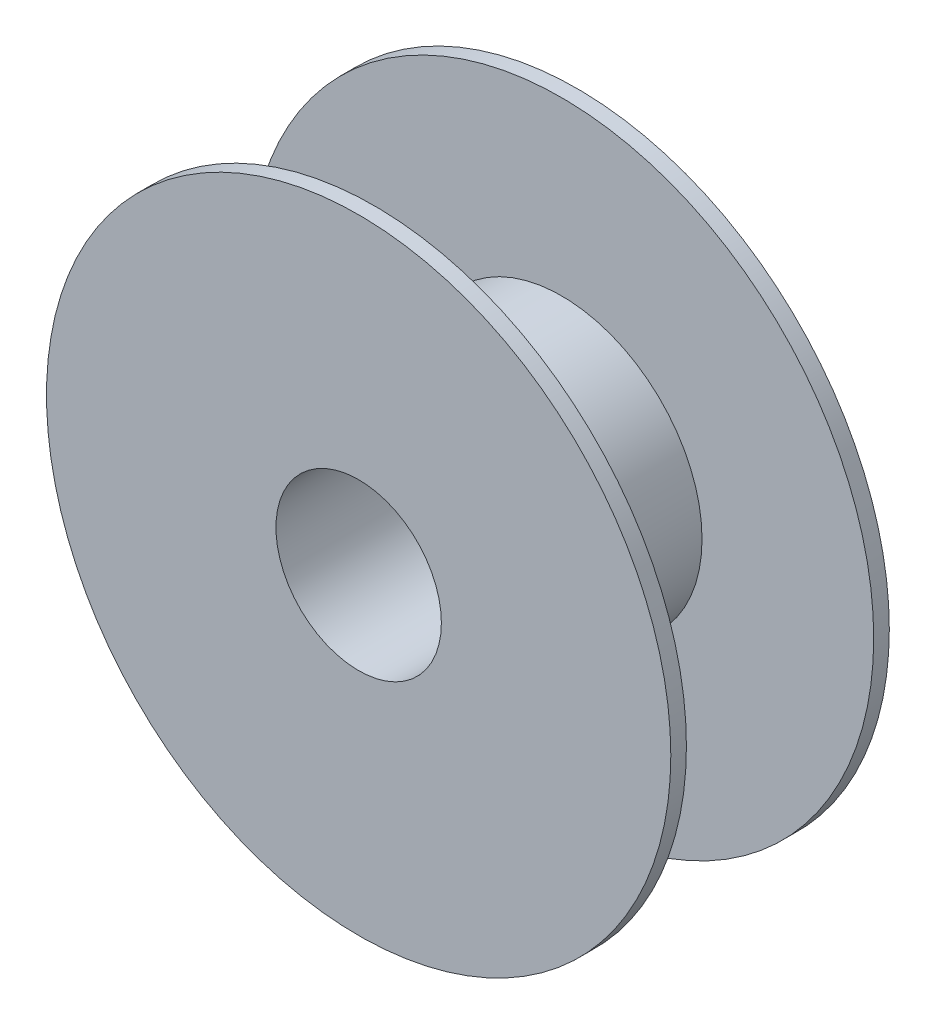
ISO-10303-21;
HEADER;
FILE_DESCRIPTION(('STEP AP214'),'2;1');
FILE_NAME('part.step','',(''),(''),'','','');
FILE_SCHEMA(('AUTOMOTIVE_DESIGN { 1 0 10303 214 1 1 1 1 }'));
ENDSEC;
DATA;
#1=APPLICATION_CONTEXT('core data for automotive mechanical design processes');
#2=APPLICATION_PROTOCOL_DEFINITION('international standard','automotive_design',2000,#1);
#3=PRODUCT_CONTEXT('',#1,'mechanical');
#4=PRODUCT('Part','Part','',(#3));
#5=PRODUCT_RELATED_PRODUCT_CATEGORY('part','',(#4));
#6=PRODUCT_DEFINITION_FORMATION('','',#4);
#7=PRODUCT_DEFINITION_CONTEXT('part definition',#1,'design');
#8=PRODUCT_DEFINITION('design','',#6,#7);
#9=PRODUCT_DEFINITION_SHAPE('','',#8);
#10=(LENGTH_UNIT() NAMED_UNIT(*) SI_UNIT(.MILLI.,.METRE.));
#11=(NAMED_UNIT(*) PLANE_ANGLE_UNIT() SI_UNIT($,.RADIAN.));
#12=(NAMED_UNIT(*) SI_UNIT($,.STERADIAN.) SOLID_ANGLE_UNIT());
#13=UNCERTAINTY_MEASURE_WITH_UNIT(LENGTH_MEASURE(1.E-05),#10,'distance_accuracy_value','');
#14=(GEOMETRIC_REPRESENTATION_CONTEXT(3) GLOBAL_UNCERTAINTY_ASSIGNED_CONTEXT((#13)) GLOBAL_UNIT_ASSIGNED_CONTEXT((#10,
#11,#12)) REPRESENTATION_CONTEXT('',''));
#15=CARTESIAN_POINT('',(0.,0.,0.));
#16=DIRECTION('',(0.,0.,1.));
#17=DIRECTION('',(1.,0.,0.));
#18=AXIS2_PLACEMENT_3D('',#15,#16,#17);
#19=CARTESIAN_POINT('',(0.,0.,70.));
#20=DIRECTION('',(0.,0.,-1.));
#21=DIRECTION('',(-1.,0.,0.));
#22=AXIS2_PLACEMENT_3D('',#19,#20,#21);
#23=CYLINDRICAL_SURFACE('',#22,100.);
#24=CARTESIAN_POINT('',(0.,0.,70.));
#25=DIRECTION('',(0.,0.,1.));
#26=DIRECTION('',(1.,0.,0.));
#27=AXIS2_PLACEMENT_3D('',#24,#25,#26);
#28=CIRCLE('',#27,100.);
#29=CARTESIAN_POINT('',(100.,0.,70.));
#30=VERTEX_POINT('',#29);
#31=EDGE_CURVE('E10',#30,#30,#28,.T.);
#32=ORIENTED_EDGE('',*,*,#31,.F.);
#33=EDGE_LOOP('',(#32));
#34=FACE_BOUND('',#33,.T.);
#35=CARTESIAN_POINT('',(0.,0.,65.));
#36=DIRECTION('',(0.,0.,1.));
#37=DIRECTION('',(1.,0.,0.));
#38=AXIS2_PLACEMENT_3D('',#35,#36,#37);
#39=CIRCLE('',#38,100.);
#40=CARTESIAN_POINT('',(100.,0.,65.));
#41=VERTEX_POINT('',#40);
#42=EDGE_CURVE('E46',#41,#41,#39,.T.);
#43=ORIENTED_EDGE('',*,*,#42,.T.);
#44=EDGE_LOOP('',(#43));
#45=FACE_BOUND('',#44,.T.);
#46=ADVANCED_FACE('F31',(#34,#45),#23,.T.);
#47=CARTESIAN_POINT('',(0.,0.,0.));
#48=DIRECTION('',(0.,0.,1.));
#49=DIRECTION('',(1.,0.,0.));
#50=AXIS2_PLACEMENT_3D('',#47,#48,#49);
#51=CIRCLE('',#50,100.);
#52=CARTESIAN_POINT('',(100.,0.,0.));
#53=VERTEX_POINT('',#52);
#54=EDGE_CURVE('E34',#53,#53,#51,.T.);
#55=ORIENTED_EDGE('',*,*,#54,.T.);
#56=EDGE_LOOP('',(#55));
#57=FACE_BOUND('',#56,.T.);
#58=CARTESIAN_POINT('',(0.,0.,5.));
#59=DIRECTION('',(0.,0.,1.));
#60=DIRECTION('',(1.,0.,0.));
#61=AXIS2_PLACEMENT_3D('',#58,#59,#60);
#62=CIRCLE('',#61,100.);
#63=CARTESIAN_POINT('',(100.,0.,5.));
#64=VERTEX_POINT('',#63);
#65=EDGE_CURVE('E57',#64,#64,#62,.T.);
#66=ORIENTED_EDGE('',*,*,#65,.F.);
#67=EDGE_LOOP('',(#66));
#68=FACE_BOUND('',#67,.T.);
#69=ADVANCED_FACE('F64',(#57,#68),#23,.T.);
#70=CARTESIAN_POINT('',(0.,0.,70.));
#71=DIRECTION('',(0.,0.,1.));
#72=DIRECTION('',(1.,0.,0.));
#73=AXIS2_PLACEMENT_3D('',#70,#71,#72);
#74=PLANE('',#73);
#75=ORIENTED_EDGE('',*,*,#31,.T.);
#76=EDGE_LOOP('',(#75));
#77=FACE_BOUND('',#76,.T.);
#78=CARTESIAN_POINT('',(0.,0.,70.));
#79=DIRECTION('',(0.,0.,1.));
#80=DIRECTION('',(1.,0.,0.));
#81=AXIS2_PLACEMENT_3D('',#78,#79,#80);
#82=CIRCLE('',#81,26.5);
#83=CARTESIAN_POINT('',(26.5,0.,70.));
#84=VERTEX_POINT('',#83);
#85=EDGE_CURVE('E41',#84,#84,#82,.T.);
#86=ORIENTED_EDGE('',*,*,#85,.F.);
#87=EDGE_LOOP('',(#86));
#88=FACE_BOUND('',#87,.T.);
#89=ADVANCED_FACE('F66',(#77,#88),#74,.T.);
#90=CARTESIAN_POINT('',(0.,0.,0.));
#91=DIRECTION('',(0.,0.,1.));
#92=DIRECTION('',(1.,0.,0.));
#93=AXIS2_PLACEMENT_3D('',#90,#91,#92);
#94=PLANE('',#93);
#95=ORIENTED_EDGE('',*,*,#54,.F.);
#96=EDGE_LOOP('',(#95));
#97=FACE_BOUND('',#96,.T.);
#98=CARTESIAN_POINT('',(0.,0.,0.));
#99=DIRECTION('',(0.,0.,1.));
#100=DIRECTION('',(1.,0.,0.));
#101=AXIS2_PLACEMENT_3D('',#98,#99,#100);
#102=CIRCLE('',#101,26.5);
#103=CARTESIAN_POINT('',(26.5,0.,0.));
#104=VERTEX_POINT('',#103);
#105=EDGE_CURVE('E43',#104,#104,#102,.T.);
#106=ORIENTED_EDGE('',*,*,#105,.T.);
#107=EDGE_LOOP('',(#106));
#108=FACE_BOUND('',#107,.T.);
#109=ADVANCED_FACE('F72',(#97,#108),#94,.F.);
#110=CARTESIAN_POINT('',(0.,0.,70.));
#111=DIRECTION('',(0.,0.,-1.));
#112=DIRECTION('',(-1.,0.,0.));
#113=AXIS2_PLACEMENT_3D('',#110,#111,#112);
#114=CYLINDRICAL_SURFACE('',#113,26.5);
#115=ORIENTED_EDGE('',*,*,#85,.T.);
#116=EDGE_LOOP('',(#115));
#117=FACE_BOUND('',#116,.T.);
#118=ORIENTED_EDGE('',*,*,#105,.F.);
#119=EDGE_LOOP('',(#118));
#120=FACE_BOUND('',#119,.T.);
#121=ADVANCED_FACE('F79',(#117,#120),#114,.F.);
#122=CARTESIAN_POINT('',(-100.,0.,65.));
#123=DIRECTION('',(0.,0.,-1.));
#124=DIRECTION('',(-1.,0.,0.));
#125=AXIS2_PLACEMENT_3D('',#122,#123,#124);
#126=PLANE('',#125);
#127=CARTESIAN_POINT('',(0.,0.,65.));
#128=DIRECTION('',(0.,0.,1.));
#129=DIRECTION('',(1.,0.,0.));
#130=AXIS2_PLACEMENT_3D('',#127,#128,#129);
#131=CIRCLE('',#130,45.);
#132=CARTESIAN_POINT('',(45.,0.,65.));
#133=VERTEX_POINT('',#132);
#134=EDGE_CURVE('E51',#133,#133,#131,.T.);
#135=ORIENTED_EDGE('',*,*,#134,.T.);
#136=EDGE_LOOP('',(#135));
#137=FACE_BOUND('',#136,.T.);
#138=ORIENTED_EDGE('',*,*,#42,.F.);
#139=EDGE_LOOP('',(#138));
#140=FACE_BOUND('',#139,.T.);
#141=ADVANCED_FACE('F83',(#137,#140),#126,.T.);
#142=CARTESIAN_POINT('',(0.,0.,0.));
#143=DIRECTION('',(0.,0.,1.));
#144=DIRECTION('',(1.,0.,0.));
#145=AXIS2_PLACEMENT_3D('',#142,#143,#144);
#146=CYLINDRICAL_SURFACE('',#145,45.);
#147=CARTESIAN_POINT('',(0.,0.,5.));
#148=DIRECTION('',(0.,0.,1.));
#149=DIRECTION('',(1.,0.,0.));
#150=AXIS2_PLACEMENT_3D('',#147,#148,#149);
#151=CIRCLE('',#150,45.);
#152=CARTESIAN_POINT('',(45.,0.,5.));
#153=VERTEX_POINT('',#152);
#154=EDGE_CURVE('E54',#153,#153,#151,.T.);
#155=ORIENTED_EDGE('',*,*,#154,.T.);
#156=EDGE_LOOP('',(#155));
#157=FACE_BOUND('',#156,.T.);
#158=ORIENTED_EDGE('',*,*,#134,.F.);
#159=EDGE_LOOP('',(#158));
#160=FACE_BOUND('',#159,.T.);
#161=ADVANCED_FACE('F89',(#157,#160),#146,.T.);
#162=CARTESIAN_POINT('',(-100.,0.,5.));
#163=DIRECTION('',(0.,0.,1.));
#164=DIRECTION('',(1.,0.,0.));
#165=AXIS2_PLACEMENT_3D('',#162,#163,#164);
#166=PLANE('',#165);
#167=ORIENTED_EDGE('',*,*,#65,.T.);
#168=EDGE_LOOP('',(#167));
#169=FACE_BOUND('',#168,.T.);
#170=ORIENTED_EDGE('',*,*,#154,.F.);
#171=EDGE_LOOP('',(#170));
#172=FACE_BOUND('',#171,.T.);
#173=ADVANCED_FACE('F61',(#169,#172),#166,.T.);
#174=CLOSED_SHELL('',(#46,#69,#89,#109,#121,#141,#161,#173));
#175=MANIFOLD_SOLID_BREP('B2',#174);
#176=ADVANCED_BREP_SHAPE_REPRESENTATION('',(#18,#175),#14);
#177=SHAPE_DEFINITION_REPRESENTATION(#9,#176);
ENDSEC;
END-ISO-10303-21;
